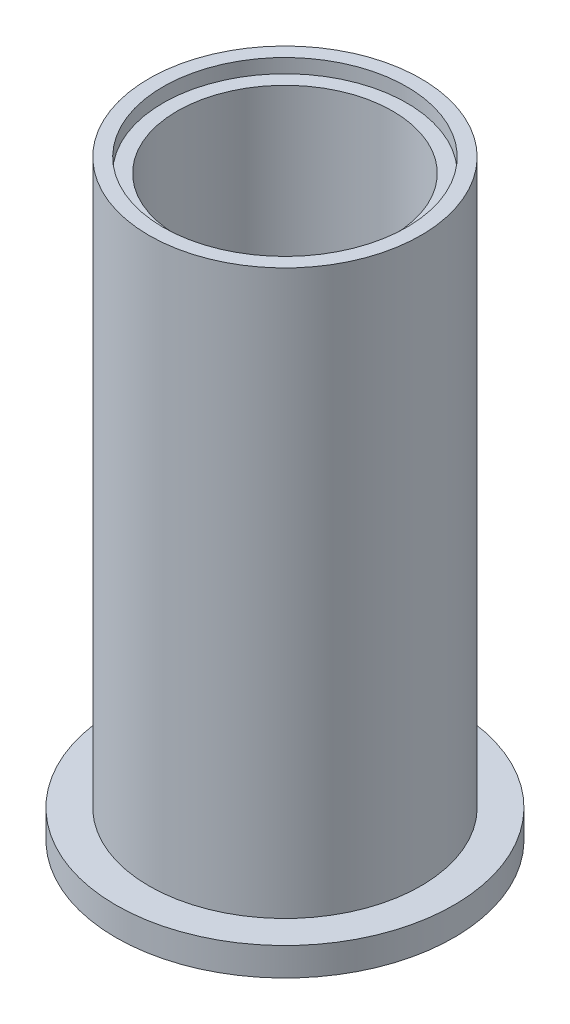
ISO-10303-21;
HEADER;
FILE_DESCRIPTION(('STEP AP214'),'2;1');
FILE_NAME('part.step','',(''),(''),'','','');
FILE_SCHEMA(('AUTOMOTIVE_DESIGN { 1 0 10303 214 1 1 1 1 }'));
ENDSEC;
DATA;
#1=APPLICATION_CONTEXT('core data for automotive mechanical design processes');
#2=APPLICATION_PROTOCOL_DEFINITION('international standard','automotive_design',2000,#1);
#3=PRODUCT_CONTEXT('',#1,'mechanical');
#4=PRODUCT('Part','Part','',(#3));
#5=PRODUCT_RELATED_PRODUCT_CATEGORY('part','',(#4));
#6=PRODUCT_DEFINITION_FORMATION('','',#4);
#7=PRODUCT_DEFINITION_CONTEXT('part definition',#1,'design');
#8=PRODUCT_DEFINITION('design','',#6,#7);
#9=PRODUCT_DEFINITION_SHAPE('','',#8);
#10=(LENGTH_UNIT() NAMED_UNIT(*) SI_UNIT(.MILLI.,.METRE.));
#11=(NAMED_UNIT(*) PLANE_ANGLE_UNIT() SI_UNIT($,.RADIAN.));
#12=(NAMED_UNIT(*) SI_UNIT($,.STERADIAN.) SOLID_ANGLE_UNIT());
#13=UNCERTAINTY_MEASURE_WITH_UNIT(LENGTH_MEASURE(1.E-05),#10,'distance_accuracy_value','');
#14=(GEOMETRIC_REPRESENTATION_CONTEXT(3) GLOBAL_UNCERTAINTY_ASSIGNED_CONTEXT((#13)) GLOBAL_UNIT_ASSIGNED_CONTEXT((#10,
#11,#12)) REPRESENTATION_CONTEXT('',''));
#15=CARTESIAN_POINT('',(0.,0.,0.));
#16=DIRECTION('',(0.,0.,1.));
#17=DIRECTION('',(1.,0.,0.));
#18=AXIS2_PLACEMENT_3D('',#15,#16,#17);
#19=CARTESIAN_POINT('',(0.,10.,0.));
#20=DIRECTION('',(0.,-1.,0.));
#21=DIRECTION('',(0.,0.,-1.));
#22=AXIS2_PLACEMENT_3D('',#19,#20,#21);
#23=CYLINDRICAL_SURFACE('',#22,60.);
#24=CARTESIAN_POINT('',(0.,10.,0.));
#25=DIRECTION('',(0.,1.,0.));
#26=DIRECTION('',(0.,0.,1.));
#27=AXIS2_PLACEMENT_3D('',#24,#25,#26);
#28=CIRCLE('',#27,60.);
#29=CARTESIAN_POINT('',(0.,10.,60.));
#30=VERTEX_POINT('',#29);
#31=EDGE_CURVE('E38',#30,#30,#28,.T.);
#32=ORIENTED_EDGE('',*,*,#31,.F.);
#33=EDGE_LOOP('',(#32));
#34=FACE_BOUND('',#33,.T.);
#35=CARTESIAN_POINT('',(0.,0.,0.));
#36=DIRECTION('',(0.,1.,0.));
#37=DIRECTION('',(0.,0.,1.));
#38=AXIS2_PLACEMENT_3D('',#35,#36,#37);
#39=CIRCLE('',#38,60.);
#40=CARTESIAN_POINT('',(0.,0.,60.));
#41=VERTEX_POINT('',#40);
#42=EDGE_CURVE('E42',#41,#41,#39,.T.);
#43=ORIENTED_EDGE('',*,*,#42,.T.);
#44=EDGE_LOOP('',(#43));
#45=FACE_BOUND('',#44,.T.);
#46=ADVANCED_FACE('F31',(#34,#45),#23,.T.);
#47=CARTESIAN_POINT('',(0.,10.,0.));
#48=DIRECTION('',(0.,1.,0.));
#49=DIRECTION('',(0.,0.,1.));
#50=AXIS2_PLACEMENT_3D('',#47,#48,#49);
#51=PLANE('',#50);
#52=CARTESIAN_POINT('',(0.,10.,0.));
#53=DIRECTION('',(0.,1.,0.));
#54=DIRECTION('',(0.,0.,1.));
#55=AXIS2_PLACEMENT_3D('',#52,#53,#54);
#56=CIRCLE('',#55,48.25);
#57=CARTESIAN_POINT('',(0.,10.,48.25));
#58=VERTEX_POINT('',#57);
#59=EDGE_CURVE('E48',#58,#58,#56,.T.);
#60=ORIENTED_EDGE('',*,*,#59,.F.);
#61=EDGE_LOOP('',(#60));
#62=FACE_BOUND('',#61,.T.);
#63=ORIENTED_EDGE('',*,*,#31,.T.);
#64=EDGE_LOOP('',(#63));
#65=FACE_BOUND('',#64,.T.);
#66=ADVANCED_FACE('F76',(#62,#65),#51,.T.);
#67=CARTESIAN_POINT('',(0.,0.,0.));
#68=DIRECTION('',(0.,1.,0.));
#69=DIRECTION('',(0.,0.,1.));
#70=AXIS2_PLACEMENT_3D('',#67,#68,#69);
#71=PLANE('',#70);
#72=ORIENTED_EDGE('',*,*,#42,.F.);
#73=EDGE_LOOP('',(#72));
#74=FACE_BOUND('',#73,.T.);
#75=ADVANCED_FACE('F85',(#74),#71,.F.);
#76=CARTESIAN_POINT('',(0.,210.,0.));
#77=DIRECTION('',(0.,1.,0.));
#78=DIRECTION('',(0.,0.,1.));
#79=AXIS2_PLACEMENT_3D('',#76,#77,#78);
#80=PLANE('',#79);
#81=CARTESIAN_POINT('',(0.,210.,0.));
#82=DIRECTION('',(0.,1.,0.));
#83=DIRECTION('',(0.,0.,1.));
#84=AXIS2_PLACEMENT_3D('',#81,#82,#83);
#85=CIRCLE('',#84,43.25);
#86=CARTESIAN_POINT('',(0.,210.,43.25));
#87=VERTEX_POINT('',#86);
#88=EDGE_CURVE('E53',#87,#87,#85,.T.);
#89=ORIENTED_EDGE('',*,*,#88,.F.);
#90=EDGE_LOOP('',(#89));
#91=FACE_BOUND('',#90,.T.);
#92=CARTESIAN_POINT('',(0.,210.,0.));
#93=DIRECTION('',(0.,1.,0.));
#94=DIRECTION('',(0.,0.,1.));
#95=AXIS2_PLACEMENT_3D('',#92,#93,#94);
#96=CIRCLE('',#95,48.25);
#97=CARTESIAN_POINT('',(0.,210.,48.25));
#98=VERTEX_POINT('',#97);
#99=EDGE_CURVE('E46',#98,#98,#96,.T.);
#100=ORIENTED_EDGE('',*,*,#99,.T.);
#101=EDGE_LOOP('',(#100));
#102=FACE_BOUND('',#101,.T.);
#103=ADVANCED_FACE('F92',(#91,#102),#80,.T.);
#104=CARTESIAN_POINT('',(0.,210.,0.));
#105=DIRECTION('',(0.,-1.,0.));
#106=DIRECTION('',(0.,0.,-1.));
#107=AXIS2_PLACEMENT_3D('',#104,#105,#106);
#108=CYLINDRICAL_SURFACE('',#107,48.25);
#109=ORIENTED_EDGE('',*,*,#99,.F.);
#110=EDGE_LOOP('',(#109));
#111=FACE_BOUND('',#110,.T.);
#112=ORIENTED_EDGE('',*,*,#59,.T.);
#113=EDGE_LOOP('',(#112));
#114=FACE_BOUND('',#113,.T.);
#115=ADVANCED_FACE('F77',(#111,#114),#108,.T.);
#116=CARTESIAN_POINT('',(0.,205.,0.));
#117=DIRECTION('',(0.,1.,0.));
#118=DIRECTION('',(0.,0.,1.));
#119=AXIS2_PLACEMENT_3D('',#116,#117,#118);
#120=CYLINDRICAL_SURFACE('',#119,43.25);
#121=CARTESIAN_POINT('',(0.,205.,0.));
#122=DIRECTION('',(0.,1.,0.));
#123=DIRECTION('',(0.,0.,1.));
#124=AXIS2_PLACEMENT_3D('',#121,#122,#123);
#125=CIRCLE('',#124,43.25);
#126=CARTESIAN_POINT('',(0.,205.,43.25));
#127=VERTEX_POINT('',#126);
#128=EDGE_CURVE('E56',#127,#127,#125,.T.);
#129=ORIENTED_EDGE('',*,*,#128,.F.);
#130=EDGE_LOOP('',(#129));
#131=FACE_BOUND('',#130,.T.);
#132=ORIENTED_EDGE('',*,*,#88,.T.);
#133=EDGE_LOOP('',(#132));
#134=FACE_BOUND('',#133,.T.);
#135=ADVANCED_FACE('F68',(#131,#134),#120,.F.);
#136=CARTESIAN_POINT('',(0.,205.,0.));
#137=DIRECTION('',(0.,1.,0.));
#138=DIRECTION('',(0.,0.,1.));
#139=AXIS2_PLACEMENT_3D('',#136,#137,#138);
#140=PLANE('',#139);
#141=CARTESIAN_POINT('',(0.,205.,0.));
#142=DIRECTION('',(0.,1.,0.));
#143=DIRECTION('',(0.,0.,1.));
#144=AXIS2_PLACEMENT_3D('',#141,#142,#143);
#145=CIRCLE('',#144,38.25);
#146=CARTESIAN_POINT('',(0.,205.,38.25));
#147=VERTEX_POINT('',#146);
#148=EDGE_CURVE('E34',#147,#147,#145,.T.);
#149=ORIENTED_EDGE('',*,*,#148,.F.);
#150=EDGE_LOOP('',(#149));
#151=FACE_BOUND('',#150,.T.);
#152=ORIENTED_EDGE('',*,*,#128,.T.);
#153=EDGE_LOOP('',(#152));
#154=FACE_BOUND('',#153,.T.);
#155=ADVANCED_FACE('F65',(#151,#154),#140,.T.);
#156=CARTESIAN_POINT('',(0.,10.,0.));
#157=DIRECTION('',(0.,1.,0.));
#158=DIRECTION('',(0.,0.,1.));
#159=AXIS2_PLACEMENT_3D('',#156,#157,#158);
#160=CIRCLE('',#159,38.25);
#161=CARTESIAN_POINT('',(0.,10.,38.25));
#162=VERTEX_POINT('',#161);
#163=EDGE_CURVE('E10',#162,#162,#160,.F.);
#164=ORIENTED_EDGE('',*,*,#163,.F.);
#165=EDGE_LOOP('',(#164));
#166=FACE_BOUND('',#165,.T.);
#167=ADVANCED_FACE('F67',(#166),#51,.T.);
#168=CARTESIAN_POINT('',(0.,210.,0.));
#169=DIRECTION('',(0.,-1.,0.));
#170=DIRECTION('',(0.,0.,-1.));
#171=AXIS2_PLACEMENT_3D('',#168,#169,#170);
#172=CYLINDRICAL_SURFACE('',#171,38.25);
#173=ORIENTED_EDGE('',*,*,#163,.T.);
#174=EDGE_LOOP('',(#173));
#175=FACE_BOUND('',#174,.T.);
#176=ORIENTED_EDGE('',*,*,#148,.T.);
#177=EDGE_LOOP('',(#176));
#178=FACE_BOUND('',#177,.T.);
#179=ADVANCED_FACE('F63',(#175,#178),#172,.F.);
#180=CLOSED_SHELL('',(#46,#66,#75,#103,#115,#135,#155,#167,#179));
#181=MANIFOLD_SOLID_BREP('B2',#180);
#182=ADVANCED_BREP_SHAPE_REPRESENTATION('',(#18,#181),#14);
#183=SHAPE_DEFINITION_REPRESENTATION(#9,#182);
ENDSEC;
END-ISO-10303-21;
